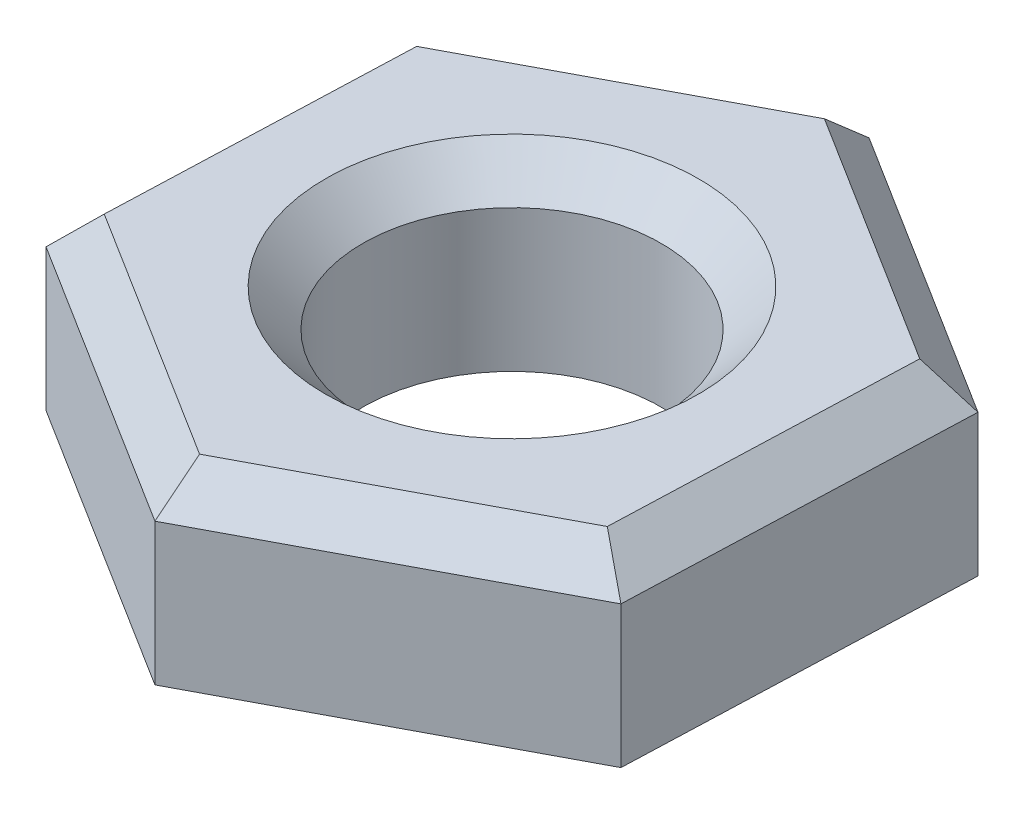
ISO-10303-21;
HEADER;
FILE_DESCRIPTION(('STEP AP214'),'2;1');
FILE_NAME('part.step','',(''),(''),'','','');
FILE_SCHEMA(('AUTOMOTIVE_DESIGN { 1 0 10303 214 1 1 1 1 }'));
ENDSEC;
DATA;
#1=APPLICATION_CONTEXT('core data for automotive mechanical design processes');
#2=APPLICATION_PROTOCOL_DEFINITION('international standard','automotive_design',2000,#1);
#3=PRODUCT_CONTEXT('',#1,'mechanical');
#4=PRODUCT('Part','Part','',(#3));
#5=PRODUCT_RELATED_PRODUCT_CATEGORY('part','',(#4));
#6=PRODUCT_DEFINITION_FORMATION('','',#4);
#7=PRODUCT_DEFINITION_CONTEXT('part definition',#1,'design');
#8=PRODUCT_DEFINITION('design','',#6,#7);
#9=PRODUCT_DEFINITION_SHAPE('','',#8);
#10=(LENGTH_UNIT() NAMED_UNIT(*) SI_UNIT(.MILLI.,.METRE.));
#11=(NAMED_UNIT(*) PLANE_ANGLE_UNIT() SI_UNIT($,.RADIAN.));
#12=(NAMED_UNIT(*) SI_UNIT($,.STERADIAN.) SOLID_ANGLE_UNIT());
#13=UNCERTAINTY_MEASURE_WITH_UNIT(LENGTH_MEASURE(1.E-05),#10,'distance_accuracy_value','');
#14=(GEOMETRIC_REPRESENTATION_CONTEXT(3) GLOBAL_UNCERTAINTY_ASSIGNED_CONTEXT((#13)) GLOBAL_UNIT_ASSIGNED_CONTEXT((#10,
#11,#12)) REPRESENTATION_CONTEXT('',''));
#15=CARTESIAN_POINT('',(0.,0.,0.));
#16=DIRECTION('',(0.,0.,1.));
#17=DIRECTION('',(1.,0.,0.));
#18=AXIS2_PLACEMENT_3D('',#15,#16,#17);
#19=CARTESIAN_POINT('',(0.0842225199523463,1.2,-2.30786479250111));
#20=DIRECTION('',(0.468083939719287,0.,0.883684007650286));
#21=DIRECTION('',(0.883684007650287,0.,-0.468083939719287));
#22=AXIS2_PLACEMENT_3D('',#19,#20,#21);
#23=PLANE('',#22);
#24=DIRECTION('',(0.,-1.,0.));
#25=VECTOR('',#24,1.);
#26=CARTESIAN_POINT('',(-1.95655827882949,1.2,-1.22687123810003));
#27=LINE('',#26,#25);
#28=CARTESIAN_POINT('',(-1.95655827882949,0.949999999999998,-1.22687123810003));
#29=VERTEX_POINT('',#28);
#30=CARTESIAN_POINT('',(-1.95655827882949,0.,-1.22687123810003));
#31=VERTEX_POINT('',#30);
#32=EDGE_CURVE('E112',#29,#31,#27,.T.);
#33=ORIENTED_EDGE('',*,*,#32,.F.);
#34=DIRECTION('',(0.883684007650287,0.,-0.468083939719287));
#35=VECTOR('',#34,1.);
#36=CARTESIAN_POINT('',(0.0842225199523463,0.949999999999998,-2.30786479250111));
#37=LINE('',#36,#35);
#38=CARTESIAN_POINT('',(0.0842225199523463,0.949999999999998,-2.30786479250111));
#39=VERTEX_POINT('',#38);
#40=EDGE_CURVE('E49',#29,#39,#37,.T.);
#41=ORIENTED_EDGE('',*,*,#40,.T.);
#42=DIRECTION('',(0.,-1.,0.));
#43=VECTOR('',#42,1.);
#44=CARTESIAN_POINT('',(0.0842225199523463,1.2,-2.30786479250111));
#45=LINE('',#44,#43);
#46=CARTESIAN_POINT('',(0.0842225199523463,0.,-2.30786479250111));
#47=VERTEX_POINT('',#46);
#48=EDGE_CURVE('E135',#39,#47,#45,.T.);
#49=ORIENTED_EDGE('',*,*,#48,.T.);
#50=DIRECTION('',(-0.883684007650286,0.,0.468083939719287));
#51=VECTOR('',#50,1.);
#52=CARTESIAN_POINT('',(0.0842225199523463,0.,-2.30786479250111));
#53=LINE('',#52,#51);
#54=EDGE_CURVE('E128',#47,#31,#53,.T.);
#55=ORIENTED_EDGE('',*,*,#54,.T.);
#56=EDGE_LOOP('',(#33,#41,#49,#55));
#57=FACE_BOUND('',#56,.T.);
#58=ADVANCED_FACE('F39',(#57),#23,.F.);
#59=CARTESIAN_POINT('',(-1.95655827882949,1.2,-1.22687123810003));
#60=DIRECTION('',(0.999334769402834,0.,0.0364694209247363));
#61=DIRECTION('',(0.0364694209247363,0.,-0.999334769402834));
#62=AXIS2_PLACEMENT_3D('',#59,#60,#61);
#63=PLANE('',#62);
#64=DIRECTION('',(0.,-1.,0.));
#65=VECTOR('',#64,1.);
#66=CARTESIAN_POINT('',(-2.04078079878184,1.2,1.08099355440108));
#67=LINE('',#66,#65);
#68=CARTESIAN_POINT('',(-2.04078079878184,0.949999999999998,1.08099355440108));
#69=VERTEX_POINT('',#68);
#70=CARTESIAN_POINT('',(-2.04078079878184,0.,1.08099355440108));
#71=VERTEX_POINT('',#70);
#72=EDGE_CURVE('E122',#69,#71,#67,.T.);
#73=ORIENTED_EDGE('',*,*,#72,.F.);
#74=DIRECTION('',(0.0364694209247363,0.,-0.999334769402834));
#75=VECTOR('',#74,1.);
#76=CARTESIAN_POINT('',(-1.95655827882949,0.949999999999998,-1.22687123810003));
#77=LINE('',#76,#75);
#78=EDGE_CURVE('E57',#69,#29,#77,.T.);
#79=ORIENTED_EDGE('',*,*,#78,.T.);
#80=ORIENTED_EDGE('',*,*,#32,.T.);
#81=DIRECTION('',(-0.0364694209247363,0.,0.999334769402834));
#82=VECTOR('',#81,1.);
#83=CARTESIAN_POINT('',(-1.95655827882949,0.,-1.22687123810003));
#84=LINE('',#83,#82);
#85=EDGE_CURVE('E115',#31,#71,#84,.T.);
#86=ORIENTED_EDGE('',*,*,#85,.T.);
#87=EDGE_LOOP('',(#73,#79,#80,#86));
#88=FACE_BOUND('',#87,.T.);
#89=ADVANCED_FACE('F114',(#88),#63,.F.);
#90=CARTESIAN_POINT('',(-2.04078079878184,1.2,1.08099355440108));
#91=DIRECTION('',(0.531250829683547,0.,-0.847214586725549));
#92=DIRECTION('',(-0.847214586725549,0.,-0.531250829683547));
#93=AXIS2_PLACEMENT_3D('',#90,#91,#92);
#94=PLANE('',#93);
#95=DIRECTION('',(0.,-1.,0.));
#96=VECTOR('',#95,1.);
#97=CARTESIAN_POINT('',(-0.0842225199523454,1.2,2.30786479250111));
#98=LINE('',#97,#96);
#99=CARTESIAN_POINT('',(-0.0842225199523454,0.949999999999998,2.30786479250111));
#100=VERTEX_POINT('',#99);
#101=CARTESIAN_POINT('',(-0.0842225199523454,0.,2.30786479250111));
#102=VERTEX_POINT('',#101);
#103=EDGE_CURVE('E165',#100,#102,#98,.T.);
#104=ORIENTED_EDGE('',*,*,#103,.F.);
#105=DIRECTION('',(-0.847214586725549,0.,-0.531250829683547));
#106=VECTOR('',#105,1.);
#107=CARTESIAN_POINT('',(-2.04078079878184,0.949999999999998,1.08099355440108));
#108=LINE('',#107,#106);
#109=EDGE_CURVE('E65',#100,#69,#108,.T.);
#110=ORIENTED_EDGE('',*,*,#109,.T.);
#111=ORIENTED_EDGE('',*,*,#72,.T.);
#112=DIRECTION('',(0.847214586725549,0.,0.531250829683547));
#113=VECTOR('',#112,1.);
#114=CARTESIAN_POINT('',(-2.04078079878184,0.,1.08099355440108));
#115=LINE('',#114,#113);
#116=EDGE_CURVE('E131',#71,#102,#115,.T.);
#117=ORIENTED_EDGE('',*,*,#116,.T.);
#118=EDGE_LOOP('',(#104,#110,#111,#117));
#119=FACE_BOUND('',#118,.T.);
#120=ADVANCED_FACE('F262',(#119),#94,.F.);
#121=CARTESIAN_POINT('',(-0.0842225199523454,1.2,2.30786479250111));
#122=DIRECTION('',(-0.468083939719287,0.,-0.883684007650286));
#123=DIRECTION('',(-0.883684007650286,0.,0.468083939719287));
#124=AXIS2_PLACEMENT_3D('',#121,#122,#123);
#125=PLANE('',#124);
#126=DIRECTION('',(0.,-1.,0.));
#127=VECTOR('',#126,1.);
#128=CARTESIAN_POINT('',(1.95655827882949,1.2,1.22687123810003));
#129=LINE('',#128,#127);
#130=CARTESIAN_POINT('',(1.95655827882949,0.949999999999998,1.22687123810003));
#131=VERTEX_POINT('',#130);
#132=CARTESIAN_POINT('',(1.95655827882949,0.,1.22687123810003));
#133=VERTEX_POINT('',#132);
#134=EDGE_CURVE('E162',#131,#133,#129,.T.);
#135=ORIENTED_EDGE('',*,*,#134,.F.);
#136=DIRECTION('',(-0.883684007650286,0.,0.468083939719287));
#137=VECTOR('',#136,1.);
#138=CARTESIAN_POINT('',(-0.0842225199523454,0.949999999999998,2.30786479250111));
#139=LINE('',#138,#137);
#140=EDGE_CURVE('E199',#131,#100,#139,.T.);
#141=ORIENTED_EDGE('',*,*,#140,.T.);
#142=ORIENTED_EDGE('',*,*,#103,.T.);
#143=DIRECTION('',(0.883684007650286,0.,-0.468083939719287));
#144=VECTOR('',#143,1.);
#145=CARTESIAN_POINT('',(-0.0842225199523454,0.,2.30786479250111));
#146=LINE('',#145,#144);
#147=EDGE_CURVE('E146',#102,#133,#146,.T.);
#148=ORIENTED_EDGE('',*,*,#147,.T.);
#149=EDGE_LOOP('',(#135,#141,#142,#148));
#150=FACE_BOUND('',#149,.T.);
#151=ADVANCED_FACE('F260',(#150),#125,.F.);
#152=CARTESIAN_POINT('',(1.95655827882949,1.2,1.22687123810003));
#153=DIRECTION('',(-0.999334769402834,0.,-0.0364694209247367));
#154=DIRECTION('',(-0.0364694209247367,0.,0.999334769402834));
#155=AXIS2_PLACEMENT_3D('',#152,#153,#154);
#156=PLANE('',#155);
#157=DIRECTION('',(0.,-1.,0.));
#158=VECTOR('',#157,1.);
#159=CARTESIAN_POINT('',(2.04078079878184,1.2,-1.08099355440108));
#160=LINE('',#159,#158);
#161=CARTESIAN_POINT('',(2.04078079878184,0.949999999999998,-1.08099355440108));
#162=VERTEX_POINT('',#161);
#163=CARTESIAN_POINT('',(2.04078079878184,0.,-1.08099355440108));
#164=VERTEX_POINT('',#163);
#165=EDGE_CURVE('E159',#162,#164,#160,.T.);
#166=ORIENTED_EDGE('',*,*,#165,.F.);
#167=DIRECTION('',(-0.0364694209247367,0.,0.999334769402834));
#168=VECTOR('',#167,1.);
#169=CARTESIAN_POINT('',(1.95655827882949,0.949999999999998,1.22687123810003));
#170=LINE('',#169,#168);
#171=EDGE_CURVE('E196',#162,#131,#170,.T.);
#172=ORIENTED_EDGE('',*,*,#171,.T.);
#173=ORIENTED_EDGE('',*,*,#134,.T.);
#174=DIRECTION('',(0.0364694209247367,0.,-0.999334769402834));
#175=VECTOR('',#174,1.);
#176=CARTESIAN_POINT('',(1.95655827882949,0.,1.22687123810003));
#177=LINE('',#176,#175);
#178=EDGE_CURVE('E150',#133,#164,#177,.T.);
#179=ORIENTED_EDGE('',*,*,#178,.T.);
#180=EDGE_LOOP('',(#166,#172,#173,#179));
#181=FACE_BOUND('',#180,.T.);
#182=ADVANCED_FACE('F258',(#181),#156,.F.);
#183=CARTESIAN_POINT('',(2.04078079878184,1.2,-1.08099355440108));
#184=DIRECTION('',(-0.531250829683546,0.,0.847214586725549));
#185=DIRECTION('',(0.84721458672555,0.,0.531250829683547));
#186=AXIS2_PLACEMENT_3D('',#183,#184,#185);
#187=PLANE('',#186);
#188=ORIENTED_EDGE('',*,*,#48,.F.);
#189=DIRECTION('',(0.84721458672555,0.,0.531250829683547));
#190=VECTOR('',#189,1.);
#191=CARTESIAN_POINT('',(2.04078079878184,0.949999999999998,-1.08099355440108));
#192=LINE('',#191,#190);
#193=EDGE_CURVE('E192',#39,#162,#192,.T.);
#194=ORIENTED_EDGE('',*,*,#193,.T.);
#195=ORIENTED_EDGE('',*,*,#165,.T.);
#196=DIRECTION('',(-0.847214586725549,0.,-0.531250829683546));
#197=VECTOR('',#196,1.);
#198=CARTESIAN_POINT('',(2.04078079878184,0.,-1.08099355440108));
#199=LINE('',#198,#197);
#200=EDGE_CURVE('E154',#164,#47,#199,.T.);
#201=ORIENTED_EDGE('',*,*,#200,.T.);
#202=EDGE_LOOP('',(#188,#194,#195,#201));
#203=FACE_BOUND('',#202,.T.);
#204=ADVANCED_FACE('F246',(#203),#187,.F.);
#205=CARTESIAN_POINT('',(0.,1.2,0.));
#206=DIRECTION('',(0.,1.,0.));
#207=DIRECTION('',(0.,0.,1.));
#208=AXIS2_PLACEMENT_3D('',#205,#206,#207);
#209=PLANE('',#208);
#210=DIRECTION('',(0.0364694209247367,0.,-0.999334769402834));
#211=VECTOR('',#210,1.);
#212=CARTESIAN_POINT('',(1.79094710643113,1.2,-1.09011090963227));
#213=LINE('',#212,#211);
#214=CARTESIAN_POINT('',(1.71198849397581,1.2,1.07351233333753));
#215=VERTEX_POINT('',#214);
#216=CARTESIAN_POINT('',(1.78568319893411,1.2,-0.945869360100947));
#217=VERTEX_POINT('',#216);
#218=EDGE_CURVE('E185',#215,#217,#213,.T.);
#219=ORIENTED_EDGE('',*,*,#218,.T.);
#220=DIRECTION('',(-0.84721458672555,0.,-0.531250829683547));
#221=VECTOR('',#220,1.);
#222=CARTESIAN_POINT('',(-0.0485901874685412,1.2,-2.09606114581972));
#223=LINE('',#222,#221);
#224=CARTESIAN_POINT('',(0.0736947049583035,1.2,-2.01938169343847));
#225=VERTEX_POINT('',#224);
#226=EDGE_CURVE('E188',#217,#225,#223,.T.);
#227=ORIENTED_EDGE('',*,*,#226,.T.);
#228=DIRECTION('',(-0.883684007650287,0.,0.468083939719287));
#229=VECTOR('',#228,1.);
#230=CARTESIAN_POINT('',(-1.83953729389967,1.2,-1.00595023618746));
#231=LINE('',#230,#229);
#232=CARTESIAN_POINT('',(-1.71198849397581,1.2,-1.07351233333753));
#233=VERTEX_POINT('',#232);
#234=EDGE_CURVE('E173',#225,#233,#231,.T.);
#235=ORIENTED_EDGE('',*,*,#234,.T.);
#236=DIRECTION('',(-0.0364694209247363,0.,0.999334769402834));
#237=VECTOR('',#236,1.);
#238=CARTESIAN_POINT('',(-1.79094710643113,1.2,1.09011090963227));
#239=LINE('',#238,#237);
#240=CARTESIAN_POINT('',(-1.78568319893411,1.2,0.945869360100947));
#241=VERTEX_POINT('',#240);
#242=EDGE_CURVE('E176',#233,#241,#239,.T.);
#243=ORIENTED_EDGE('',*,*,#242,.T.);
#244=DIRECTION('',(0.847214586725549,0.,0.531250829683547));
#245=VECTOR('',#244,1.);
#246=CARTESIAN_POINT('',(0.0485901874685424,1.2,2.09606114581972));
#247=LINE('',#246,#245);
#248=CARTESIAN_POINT('',(-0.0736947049583018,1.2,2.01938169343847));
#249=VERTEX_POINT('',#248);
#250=EDGE_CURVE('E179',#241,#249,#247,.T.);
#251=ORIENTED_EDGE('',*,*,#250,.T.);
#252=DIRECTION('',(0.883684007650286,0.,-0.468083939719287));
#253=VECTOR('',#252,1.);
#254=CARTESIAN_POINT('',(1.83953729389967,1.2,1.00595023618746));
#255=LINE('',#254,#253);
#256=EDGE_CURVE('E182',#249,#215,#255,.T.);
#257=ORIENTED_EDGE('',*,*,#256,.T.);
#258=EDGE_LOOP('',(#219,#227,#235,#243,#251,#257));
#259=FACE_BOUND('',#258,.T.);
#260=CARTESIAN_POINT('',(0.,1.2,0.));
#261=DIRECTION('',(0.,1.,0.));
#262=DIRECTION('',(0.,0.,1.));
#263=AXIS2_PLACEMENT_3D('',#260,#261,#262);
#264=CIRCLE('',#263,1.25);
#265=CARTESIAN_POINT('',(0.,1.2,1.25));
#266=VERTEX_POINT('',#265);
#267=EDGE_CURVE('E121',#266,#266,#264,.F.);
#268=ORIENTED_EDGE('',*,*,#267,.T.);
#269=EDGE_LOOP('',(#268));
#270=FACE_BOUND('',#269,.T.);
#271=ADVANCED_FACE('F295',(#259,#270),#209,.T.);
#272=CARTESIAN_POINT('',(0.,0.,0.));
#273=DIRECTION('',(0.,1.,0.));
#274=DIRECTION('',(0.,0.,1.));
#275=AXIS2_PLACEMENT_3D('',#272,#273,#274);
#276=PLANE('',#275);
#277=CARTESIAN_POINT('',(0.,0.,0.));
#278=DIRECTION('',(0.,1.,0.));
#279=DIRECTION('',(0.,0.,1.));
#280=AXIS2_PLACEMENT_3D('',#277,#278,#279);
#281=CIRCLE('',#280,1.);
#282=CARTESIAN_POINT('',(0.,0.,1.));
#283=VERTEX_POINT('',#282);
#284=EDGE_CURVE('E138',#283,#283,#281,.T.);
#285=ORIENTED_EDGE('',*,*,#284,.T.);
#286=EDGE_LOOP('',(#285));
#287=FACE_BOUND('',#286,.T.);
#288=ORIENTED_EDGE('',*,*,#54,.F.);
#289=ORIENTED_EDGE('',*,*,#200,.F.);
#290=ORIENTED_EDGE('',*,*,#178,.F.);
#291=ORIENTED_EDGE('',*,*,#147,.F.);
#292=ORIENTED_EDGE('',*,*,#116,.F.);
#293=ORIENTED_EDGE('',*,*,#85,.F.);
#294=EDGE_LOOP('',(#288,#289,#290,#291,#292,#293));
#295=FACE_BOUND('',#294,.T.);
#296=ADVANCED_FACE('F126',(#287,#295),#276,.F.);
#297=CARTESIAN_POINT('',(0.,-0.4,0.));
#298=DIRECTION('',(0.,1.,0.));
#299=DIRECTION('',(0.,0.,1.));
#300=AXIS2_PLACEMENT_3D('',#297,#298,#299);
#301=CYLINDRICAL_SURFACE('',#300,1.);
#302=CARTESIAN_POINT('',(0.,0.950000000000001,0.));
#303=DIRECTION('',(0.,1.,0.));
#304=DIRECTION('',(0.,0.,1.));
#305=AXIS2_PLACEMENT_3D('',#302,#303,#304);
#306=CIRCLE('',#305,1.);
#307=CARTESIAN_POINT('',(0.,0.950000000000001,1.));
#308=VERTEX_POINT('',#307);
#309=EDGE_CURVE('E11',#308,#308,#306,.T.);
#310=ORIENTED_EDGE('',*,*,#309,.T.);
#311=EDGE_LOOP('',(#310));
#312=FACE_BOUND('',#311,.T.);
#313=ORIENTED_EDGE('',*,*,#284,.F.);
#314=EDGE_LOOP('',(#313));
#315=FACE_BOUND('',#314,.T.);
#316=ADVANCED_FACE('F286',(#312,#315),#301,.F.);
#317=CARTESIAN_POINT('',(-0.929688951946205,1.2,1.48262552676971));
#318=DIRECTION('',(-0.375651064180216,0.707106781186547,0.599071179393795));
#319=DIRECTION('',(-0.847214586725549,0.,-0.531250829683547));
#320=AXIS2_PLACEMENT_3D('',#317,#318,#319);
#321=PLANE('',#320);
#322=DIRECTION('',(0.668002320516444,0.654653670707978,-0.353838199200166));
#323=VECTOR('',#322,1.);
#324=CARTESIAN_POINT('',(-1.53058559908638,1.45,0.810745165800812));
#325=LINE('',#324,#323);
#326=EDGE_CURVE('E221',#69,#241,#325,.T.);
#327=ORIENTED_EDGE('',*,*,#326,.F.);
#328=ORIENTED_EDGE('',*,*,#109,.F.);
#329=DIRECTION('',(0.0275682909215389,0.654653670707977,-0.755426078954279));
#330=VECTOR('',#329,1.);
#331=CARTESIAN_POINT('',(-0.0631668899642591,1.45,1.73089859437583));
#332=LINE('',#331,#330);
#333=EDGE_CURVE('E43',#249,#100,#332,.F.);
#334=ORIENTED_EDGE('',*,*,#333,.F.);
#335=ORIENTED_EDGE('',*,*,#250,.F.);
#336=EDGE_LOOP('',(#327,#328,#334,#335));
#337=FACE_BOUND('',#336,.T.);
#338=ADVANCED_FACE('F237',(#337),#321,.T.);
#339=CARTESIAN_POINT('',(0.819146894508751,1.2,1.546447013388));
#340=DIRECTION('',(0.330985327940023,0.707106781186548,0.624858954235622));
#341=DIRECTION('',(-0.883684007650286,0.,0.468083939719287));
#342=AXIS2_PLACEMENT_3D('',#339,#340,#341);
#343=PLANE('',#342);
#344=ORIENTED_EDGE('',*,*,#333,.T.);
#345=ORIENTED_EDGE('',*,*,#140,.F.);
#346=DIRECTION('',(-0.640434029594904,0.654653670707977,-0.401587879754113));
#347=VECTOR('',#346,1.);
#348=CARTESIAN_POINT('',(1.46741870912212,1.45,0.920153428575022));
#349=LINE('',#348,#347);
#350=EDGE_CURVE('E218',#215,#131,#349,.F.);
#351=ORIENTED_EDGE('',*,*,#350,.F.);
#352=ORIENTED_EDGE('',*,*,#256,.F.);
#353=EDGE_LOOP('',(#344,#345,#351,#352));
#354=FACE_BOUND('',#353,.T.);
#355=ADVANCED_FACE('F233',(#354),#343,.T.);
#356=CARTESIAN_POINT('',(-1.74883584645496,1.2,-0.0638214866182885));
#357=DIRECTION('',(-0.706636392120239,0.707106781186547,-0.0257877748418276));
#358=DIRECTION('',(0.0364694209247363,0.,-0.999334769402834));
#359=AXIS2_PLACEMENT_3D('',#356,#357,#358);
#360=PLANE('',#359);
#361=ORIENTED_EDGE('',*,*,#326,.T.);
#362=ORIENTED_EDGE('',*,*,#242,.F.);
#363=DIRECTION('',(0.640434029594905,0.654653670707977,0.401587879754114));
#364=VECTOR('',#363,1.);
#365=CARTESIAN_POINT('',(-1.46741870912212,1.45,-0.920153428575022));
#366=LINE('',#365,#364);
#367=EDGE_CURVE('E214',#29,#233,#366,.T.);
#368=ORIENTED_EDGE('',*,*,#367,.F.);
#369=ORIENTED_EDGE('',*,*,#78,.F.);
#370=EDGE_LOOP('',(#361,#362,#368,#369));
#371=FACE_BOUND('',#370,.T.);
#372=ADVANCED_FACE('F238',(#371),#360,.T.);
#373=CARTESIAN_POINT('',(1.74883584645496,1.2,0.0638214866182892));
#374=DIRECTION('',(0.706636392120239,0.707106781186547,0.0257877748418279));
#375=DIRECTION('',(-0.0364694209247367,0.,0.999334769402834));
#376=AXIS2_PLACEMENT_3D('',#373,#374,#375);
#377=PLANE('',#376);
#378=ORIENTED_EDGE('',*,*,#350,.T.);
#379=ORIENTED_EDGE('',*,*,#171,.F.);
#380=DIRECTION('',(-0.668002320516444,0.654653670707978,0.353838199200165));
#381=VECTOR('',#380,1.);
#382=CARTESIAN_POINT('',(1.53058559908638,1.45,-0.810745165800812));
#383=LINE('',#382,#381);
#384=EDGE_CURVE('E211',#217,#162,#383,.F.);
#385=ORIENTED_EDGE('',*,*,#384,.F.);
#386=ORIENTED_EDGE('',*,*,#218,.F.);
#387=EDGE_LOOP('',(#378,#379,#385,#386));
#388=FACE_BOUND('',#387,.T.);
#389=ADVANCED_FACE('F255',(#388),#377,.T.);
#390=CARTESIAN_POINT('',(-0.81914689450875,1.2,-1.546447013388));
#391=DIRECTION('',(-0.330985327940023,0.707106781186548,-0.624858954235622));
#392=DIRECTION('',(0.883684007650287,0.,-0.468083939719287));
#393=AXIS2_PLACEMENT_3D('',#390,#391,#392);
#394=PLANE('',#393);
#395=ORIENTED_EDGE('',*,*,#367,.T.);
#396=ORIENTED_EDGE('',*,*,#234,.F.);
#397=DIRECTION('',(0.027568290921538,-0.654653670707978,-0.755426078954279));
#398=VECTOR('',#397,1.);
#399=CARTESIAN_POINT('',(0.063166889964261,1.45,-1.73089859437584));
#400=LINE('',#399,#398);
#401=EDGE_CURVE('E208',#39,#225,#400,.F.);
#402=ORIENTED_EDGE('',*,*,#401,.F.);
#403=ORIENTED_EDGE('',*,*,#40,.F.);
#404=EDGE_LOOP('',(#395,#396,#402,#403));
#405=FACE_BOUND('',#404,.T.);
#406=ADVANCED_FACE('F243',(#405),#394,.T.);
#407=CARTESIAN_POINT('',(0.929688951946205,1.2,-1.48262552676971));
#408=DIRECTION('',(0.375651064180216,0.707106781186547,-0.599071179393795));
#409=DIRECTION('',(0.84721458672555,0.,0.531250829683547));
#410=AXIS2_PLACEMENT_3D('',#407,#408,#409);
#411=PLANE('',#410);
#412=ORIENTED_EDGE('',*,*,#384,.T.);
#413=ORIENTED_EDGE('',*,*,#193,.F.);
#414=ORIENTED_EDGE('',*,*,#401,.T.);
#415=ORIENTED_EDGE('',*,*,#226,.F.);
#416=EDGE_LOOP('',(#412,#413,#414,#415));
#417=FACE_BOUND('',#416,.T.);
#418=ADVANCED_FACE('F249',(#417),#411,.T.);
#419=CARTESIAN_POINT('',(0.,0.950000000000001,0.));
#420=DIRECTION('',(0.,1.,0.));
#421=DIRECTION('',(0.,0.,1.));
#422=AXIS2_PLACEMENT_3D('',#419,#420,#421);
#423=CONICAL_SURFACE('',#422,1.,0.78539816339745);
#424=ORIENTED_EDGE('',*,*,#267,.F.);
#425=EDGE_LOOP('',(#424));
#426=FACE_BOUND('',#425,.T.);
#427=ORIENTED_EDGE('',*,*,#309,.F.);
#428=EDGE_LOOP('',(#427));
#429=FACE_BOUND('',#428,.T.);
#430=ADVANCED_FACE('F41',(#426,#429),#423,.F.);
#431=CLOSED_SHELL('',(#58,#89,#120,#151,#182,#204,#271,#296,#316,#338,#355,#372,#389,#406,#418,#430));
#432=MANIFOLD_SOLID_BREP('B2',#431);
#433=ADVANCED_BREP_SHAPE_REPRESENTATION('',(#18,#432),#14);
#434=SHAPE_DEFINITION_REPRESENTATION(#9,#433);
ENDSEC;
END-ISO-10303-21;
